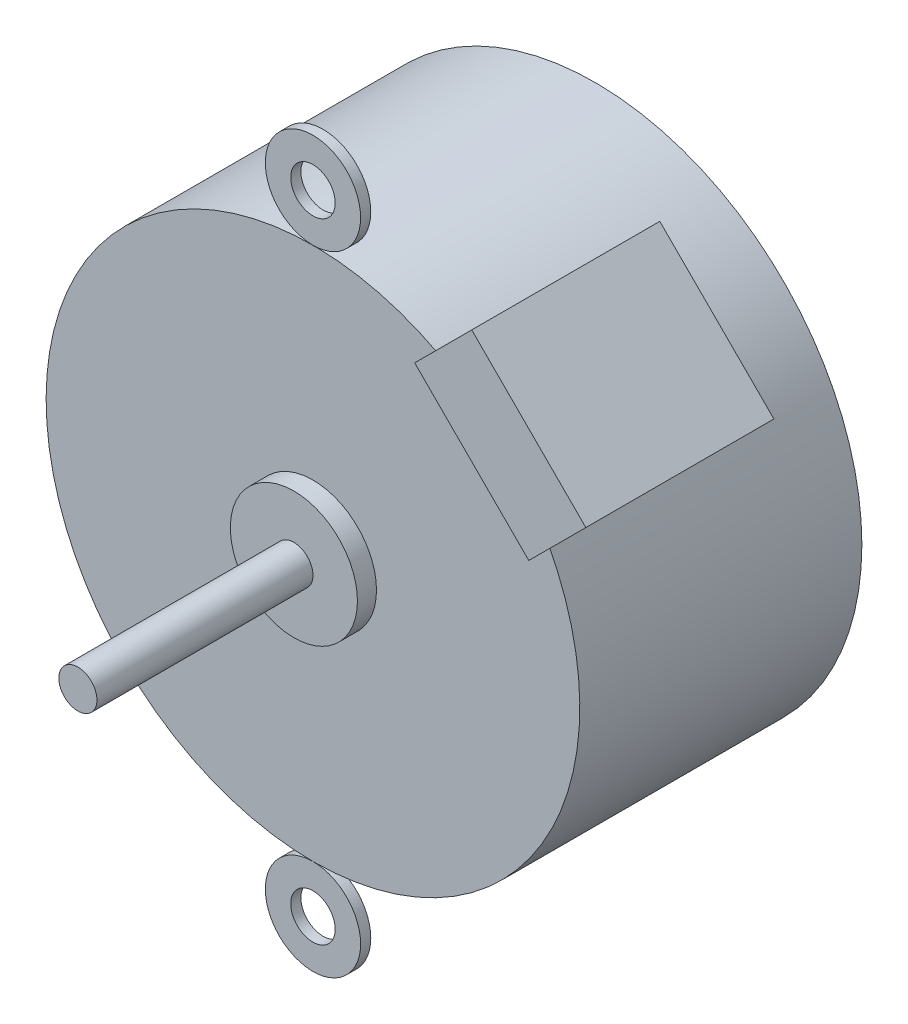
ISO-10303-21;
HEADER;
FILE_DESCRIPTION(('STEP AP214'),'2;1');
FILE_NAME('part.step','',(''),(''),'','','');
FILE_SCHEMA(('AUTOMOTIVE_DESIGN { 1 0 10303 214 1 1 1 1 }'));
ENDSEC;
DATA;
#1=APPLICATION_CONTEXT('core data for automotive mechanical design processes');
#2=APPLICATION_PROTOCOL_DEFINITION('international standard','automotive_design',2000,#1);
#3=PRODUCT_CONTEXT('',#1,'mechanical');
#4=PRODUCT('Part','Part','',(#3));
#5=PRODUCT_RELATED_PRODUCT_CATEGORY('part','',(#4));
#6=PRODUCT_DEFINITION_FORMATION('','',#4);
#7=PRODUCT_DEFINITION_CONTEXT('part definition',#1,'design');
#8=PRODUCT_DEFINITION('design','',#6,#7);
#9=PRODUCT_DEFINITION_SHAPE('','',#8);
#10=(LENGTH_UNIT() NAMED_UNIT(*) SI_UNIT(.MILLI.,.METRE.));
#11=(NAMED_UNIT(*) PLANE_ANGLE_UNIT() SI_UNIT($,.RADIAN.));
#12=(NAMED_UNIT(*) SI_UNIT($,.STERADIAN.) SOLID_ANGLE_UNIT());
#13=UNCERTAINTY_MEASURE_WITH_UNIT(LENGTH_MEASURE(1.E-05),#10,'distance_accuracy_value','');
#14=(GEOMETRIC_REPRESENTATION_CONTEXT(3) GLOBAL_UNCERTAINTY_ASSIGNED_CONTEXT((#13)) GLOBAL_UNIT_ASSIGNED_CONTEXT((#10,
#11,#12)) REPRESENTATION_CONTEXT('',''));
#15=CARTESIAN_POINT('',(0.,0.,0.));
#16=DIRECTION('',(0.,0.,1.));
#17=DIRECTION('',(1.,0.,0.));
#18=AXIS2_PLACEMENT_3D('',#15,#16,#17);
#19=CARTESIAN_POINT('',(0.,-24.75,0.8));
#20=DIRECTION('',(0.,0.,-1.));
#21=DIRECTION('',(-1.,0.,0.));
#22=AXIS2_PLACEMENT_3D('',#19,#20,#21);
#23=CYLINDRICAL_SURFACE('',#22,3.75);
#24=CARTESIAN_POINT('',(0.,-24.75,0.8));
#25=DIRECTION('',(0.,0.,1.));
#26=DIRECTION('',(1.,0.,0.));
#27=AXIS2_PLACEMENT_3D('',#24,#25,#26);
#28=CIRCLE('',#27,3.75);
#29=CARTESIAN_POINT('',(3.75,-24.75,0.8));
#30=VERTEX_POINT('',#29);
#31=EDGE_CURVE('E11',#30,#30,#28,.T.);
#32=ORIENTED_EDGE('',*,*,#31,.F.);
#33=EDGE_LOOP('',(#32));
#34=FACE_BOUND('',#33,.T.);
#35=CARTESIAN_POINT('',(0.,-24.75,0.));
#36=DIRECTION('',(0.,0.,1.));
#37=DIRECTION('',(1.,0.,0.));
#38=AXIS2_PLACEMENT_3D('',#35,#36,#37);
#39=CIRCLE('',#38,3.75);
#40=CARTESIAN_POINT('',(3.75,-24.75,0.));
#41=VERTEX_POINT('',#40);
#42=EDGE_CURVE('E54',#41,#41,#39,.T.);
#43=ORIENTED_EDGE('',*,*,#42,.T.);
#44=EDGE_LOOP('',(#43));
#45=FACE_BOUND('',#44,.T.);
#46=ADVANCED_FACE('F55',(#34,#45),#23,.T.);
#47=CARTESIAN_POINT('',(0.,-24.75,0.8));
#48=DIRECTION('',(0.,0.,1.));
#49=DIRECTION('',(1.,0.,0.));
#50=AXIS2_PLACEMENT_3D('',#47,#48,#49);
#51=PLANE('',#50);
#52=CARTESIAN_POINT('',(0.,-24.75,0.8));
#53=DIRECTION('',(0.,0.,1.));
#54=DIRECTION('',(1.,0.,0.));
#55=AXIS2_PLACEMENT_3D('',#52,#53,#54);
#56=CIRCLE('',#55,1.75);
#57=CARTESIAN_POINT('',(1.75,-24.75,0.8));
#58=VERTEX_POINT('',#57);
#59=EDGE_CURVE('E65',#58,#58,#56,.F.);
#60=ORIENTED_EDGE('',*,*,#59,.T.);
#61=EDGE_LOOP('',(#60));
#62=FACE_BOUND('',#61,.T.);
#63=ORIENTED_EDGE('',*,*,#31,.T.);
#64=EDGE_LOOP('',(#63));
#65=FACE_BOUND('',#64,.T.);
#66=ADVANCED_FACE('F79',(#62,#65),#51,.T.);
#67=CARTESIAN_POINT('',(0.,-24.75,0.));
#68=DIRECTION('',(0.,0.,1.));
#69=DIRECTION('',(1.,0.,0.));
#70=AXIS2_PLACEMENT_3D('',#67,#68,#69);
#71=PLANE('',#70);
#72=CARTESIAN_POINT('',(0.,-24.75,0.));
#73=DIRECTION('',(0.,0.,1.));
#74=DIRECTION('',(1.,0.,0.));
#75=AXIS2_PLACEMENT_3D('',#72,#73,#74);
#76=CIRCLE('',#75,1.75);
#77=CARTESIAN_POINT('',(1.75,-24.75,0.));
#78=VERTEX_POINT('',#77);
#79=EDGE_CURVE('E66',#78,#78,#76,.T.);
#80=ORIENTED_EDGE('',*,*,#79,.T.);
#81=EDGE_LOOP('',(#80));
#82=FACE_BOUND('',#81,.T.);
#83=ORIENTED_EDGE('',*,*,#42,.F.);
#84=EDGE_LOOP('',(#83));
#85=FACE_BOUND('',#84,.T.);
#86=ADVANCED_FACE('F69',(#82,#85),#71,.F.);
#87=CARTESIAN_POINT('',(0.,-24.75,1.8));
#88=DIRECTION('',(0.,0.,-1.));
#89=DIRECTION('',(-1.,0.,0.));
#90=AXIS2_PLACEMENT_3D('',#87,#88,#89);
#91=CYLINDRICAL_SURFACE('',#90,1.75);
#92=ORIENTED_EDGE('',*,*,#59,.F.);
#93=EDGE_LOOP('',(#92));
#94=FACE_BOUND('',#93,.T.);
#95=ORIENTED_EDGE('',*,*,#79,.F.);
#96=EDGE_LOOP('',(#95));
#97=FACE_BOUND('',#96,.T.);
#98=ADVANCED_FACE('F71',(#94,#97),#91,.F.);
#99=CLOSED_SHELL('',(#46,#66,#86,#98));
#100=MANIFOLD_SOLID_BREP('B2',#99);
#101=CARTESIAN_POINT('',(0.,24.75,0.8));
#102=DIRECTION('',(0.,0.,-1.));
#103=DIRECTION('',(-1.,0.,0.));
#104=AXIS2_PLACEMENT_3D('',#101,#102,#103);
#105=CYLINDRICAL_SURFACE('',#104,3.75);
#106=CARTESIAN_POINT('',(0.,24.75,0.8));
#107=DIRECTION('',(0.,0.,1.));
#108=DIRECTION('',(1.,0.,0.));
#109=AXIS2_PLACEMENT_3D('',#106,#107,#108);
#110=CIRCLE('',#109,3.75);
#111=CARTESIAN_POINT('',(3.75,24.75,0.8));
#112=VERTEX_POINT('',#111);
#113=EDGE_CURVE('E51',#112,#112,#110,.T.);
#114=ORIENTED_EDGE('',*,*,#113,.F.);
#115=EDGE_LOOP('',(#114));
#116=FACE_BOUND('',#115,.T.);
#117=CARTESIAN_POINT('',(0.,24.75,0.));
#118=DIRECTION('',(0.,0.,1.));
#119=DIRECTION('',(1.,0.,0.));
#120=AXIS2_PLACEMENT_3D('',#117,#118,#119);
#121=CIRCLE('',#120,3.75);
#122=CARTESIAN_POINT('',(3.75,24.75,0.));
#123=VERTEX_POINT('',#122);
#124=EDGE_CURVE('E127',#123,#123,#121,.T.);
#125=ORIENTED_EDGE('',*,*,#124,.T.);
#126=EDGE_LOOP('',(#125));
#127=FACE_BOUND('',#126,.T.);
#128=ADVANCED_FACE('F122',(#116,#127),#105,.T.);
#129=CARTESIAN_POINT('',(0.,24.75,0.8));
#130=DIRECTION('',(0.,0.,1.));
#131=DIRECTION('',(1.,0.,0.));
#132=AXIS2_PLACEMENT_3D('',#129,#130,#131);
#133=PLANE('',#132);
#134=CARTESIAN_POINT('',(0.,24.75,0.8));
#135=DIRECTION('',(0.,0.,1.));
#136=DIRECTION('',(1.,0.,0.));
#137=AXIS2_PLACEMENT_3D('',#134,#135,#136);
#138=CIRCLE('',#137,1.75);
#139=CARTESIAN_POINT('',(1.75,24.75,0.8));
#140=VERTEX_POINT('',#139);
#141=EDGE_CURVE('E132',#140,#140,#138,.F.);
#142=ORIENTED_EDGE('',*,*,#141,.T.);
#143=EDGE_LOOP('',(#142));
#144=FACE_BOUND('',#143,.T.);
#145=ORIENTED_EDGE('',*,*,#113,.T.);
#146=EDGE_LOOP('',(#145));
#147=FACE_BOUND('',#146,.T.);
#148=ADVANCED_FACE('F151',(#144,#147),#133,.T.);
#149=CARTESIAN_POINT('',(0.,24.75,0.));
#150=DIRECTION('',(0.,0.,1.));
#151=DIRECTION('',(1.,0.,0.));
#152=AXIS2_PLACEMENT_3D('',#149,#150,#151);
#153=PLANE('',#152);
#154=CARTESIAN_POINT('',(0.,24.75,0.));
#155=DIRECTION('',(0.,0.,1.));
#156=DIRECTION('',(1.,0.,0.));
#157=AXIS2_PLACEMENT_3D('',#154,#155,#156);
#158=CIRCLE('',#157,1.75);
#159=CARTESIAN_POINT('',(1.75,24.75,0.));
#160=VERTEX_POINT('',#159);
#161=EDGE_CURVE('E140',#160,#160,#158,.T.);
#162=ORIENTED_EDGE('',*,*,#161,.T.);
#163=EDGE_LOOP('',(#162));
#164=FACE_BOUND('',#163,.T.);
#165=ORIENTED_EDGE('',*,*,#124,.F.);
#166=EDGE_LOOP('',(#165));
#167=FACE_BOUND('',#166,.T.);
#168=ADVANCED_FACE('F143',(#164,#167),#153,.F.);
#169=CARTESIAN_POINT('',(0.,24.75,1.8));
#170=DIRECTION('',(0.,0.,-1.));
#171=DIRECTION('',(-1.,0.,0.));
#172=AXIS2_PLACEMENT_3D('',#169,#170,#171);
#173=CYLINDRICAL_SURFACE('',#172,1.75);
#174=ORIENTED_EDGE('',*,*,#141,.F.);
#175=EDGE_LOOP('',(#174));
#176=FACE_BOUND('',#175,.T.);
#177=ORIENTED_EDGE('',*,*,#161,.F.);
#178=EDGE_LOOP('',(#177));
#179=FACE_BOUND('',#178,.T.);
#180=ADVANCED_FACE('F145',(#176,#179),#173,.F.);
#181=CLOSED_SHELL('',(#128,#148,#168,#180));
#182=MANIFOLD_SOLID_BREP('B6',#181);
#183=CARTESIAN_POINT('',(0.,0.,0.8));
#184=DIRECTION('',(0.,0.,-1.));
#185=DIRECTION('',(-1.,0.,0.));
#186=AXIS2_PLACEMENT_3D('',#183,#184,#185);
#187=CYLINDRICAL_SURFACE('',#186,21.);
#188=CARTESIAN_POINT('',(0.,0.,-21.4));
#189=DIRECTION('',(0.,0.,1.));
#190=DIRECTION('',(1.,0.,0.));
#191=AXIS2_PLACEMENT_3D('',#188,#189,#190);
#192=CIRCLE('',#191,21.);
#193=CARTESIAN_POINT('',(21.,0.,-21.4));
#194=VERTEX_POINT('',#193);
#195=EDGE_CURVE('E307',#194,#194,#192,.T.);
#196=ORIENTED_EDGE('',*,*,#195,.T.);
#197=EDGE_LOOP('',(#196));
#198=FACE_BOUND('',#197,.T.);
#199=DIRECTION('',(0.,0.,-1.));
#200=VECTOR('',#199,1.);
#201=CARTESIAN_POINT('',(17.7167136960055,11.2746643326429,0.8));
#202=LINE('',#201,#200);
#203=CARTESIAN_POINT('',(17.7167136960055,11.2746643326429,-12.));
#204=VERTEX_POINT('',#203);
#205=CARTESIAN_POINT('',(17.7167136960055,11.2746643326429,0.8));
#206=VERTEX_POINT('',#205);
#207=EDGE_CURVE('E312',#204,#206,#202,.F.);
#208=ORIENTED_EDGE('',*,*,#207,.T.);
#209=CARTESIAN_POINT('',(0.,0.,0.8));
#210=DIRECTION('',(0.,0.,1.));
#211=DIRECTION('',(1.,0.,0.));
#212=AXIS2_PLACEMENT_3D('',#209,#210,#211);
#213=CIRCLE('',#212,21.);
#214=CARTESIAN_POINT('',(11.2746643326427,17.7167136960056,0.8));
#215=VERTEX_POINT('',#214);
#216=EDGE_CURVE('E313',#215,#206,#213,.T.);
#217=ORIENTED_EDGE('',*,*,#216,.F.);
#218=DIRECTION('',(0.,0.,-1.));
#219=VECTOR('',#218,1.);
#220=CARTESIAN_POINT('',(11.2746643326427,17.7167136960057,0.8));
#221=LINE('',#220,#219);
#222=CARTESIAN_POINT('',(11.2746643326427,17.7167136960057,-12.));
#223=VERTEX_POINT('',#222);
#224=EDGE_CURVE('E199',#215,#223,#221,.T.);
#225=ORIENTED_EDGE('',*,*,#224,.T.);
#226=CARTESIAN_POINT('',(0.,0.,-12.));
#227=DIRECTION('',(0.,0.,-1.));
#228=DIRECTION('',(-1.,0.,0.));
#229=AXIS2_PLACEMENT_3D('',#226,#227,#228);
#230=CIRCLE('',#229,21.);
#231=EDGE_CURVE('E192',#223,#204,#230,.T.);
#232=ORIENTED_EDGE('',*,*,#231,.T.);
#233=EDGE_LOOP('',(#208,#217,#225,#232));
#234=FACE_BOUND('',#233,.T.);
#235=ADVANCED_FACE('F183',(#198,#234),#187,.T.);
#236=CARTESIAN_POINT('',(0.,0.,0.8));
#237=DIRECTION('',(0.,0.,1.));
#238=DIRECTION('',(1.,0.,0.));
#239=AXIS2_PLACEMENT_3D('',#236,#237,#238);
#240=PLANE('',#239);
#241=CARTESIAN_POINT('',(0.,0.,0.8));
#242=DIRECTION('',(0.,0.,1.));
#243=DIRECTION('',(1.,0.,0.));
#244=AXIS2_PLACEMENT_3D('',#241,#242,#243);
#245=CIRCLE('',#244,5.);
#246=CARTESIAN_POINT('',(5.,0.,0.8));
#247=VERTEX_POINT('',#246);
#248=EDGE_CURVE('E301',#247,#247,#245,.F.);
#249=ORIENTED_EDGE('',*,*,#248,.T.);
#250=EDGE_LOOP('',(#249));
#251=FACE_BOUND('',#250,.T.);
#252=ORIENTED_EDGE('',*,*,#216,.T.);
#253=DIRECTION('',(-0.707106781186551,0.707106781186544,0.));
#254=VECTOR('',#253,1.);
#255=CARTESIAN_POINT('',(14.4956890143241,14.4956890143243,0.8));
#256=LINE('',#255,#254);
#257=EDGE_CURVE('E121',#206,#215,#256,.T.);
#258=ORIENTED_EDGE('',*,*,#257,.T.);
#259=EDGE_LOOP('',(#252,#258));
#260=FACE_BOUND('',#259,.T.);
#261=ADVANCED_FACE('F349',(#251,#260),#240,.T.);
#262=CARTESIAN_POINT('',(0.,0.,-21.4));
#263=DIRECTION('',(0.,0.,1.));
#264=DIRECTION('',(1.,0.,0.));
#265=AXIS2_PLACEMENT_3D('',#262,#263,#264);
#266=PLANE('',#265);
#267=CARTESIAN_POINT('',(0.,0.,-21.4));
#268=DIRECTION('',(0.,0.,1.));
#269=DIRECTION('',(1.,0.,0.));
#270=AXIS2_PLACEMENT_3D('',#267,#268,#269);
#271=CIRCLE('',#270,4.);
#272=CARTESIAN_POINT('',(4.,0.,-21.4));
#273=VERTEX_POINT('',#272);
#274=EDGE_CURVE('E308',#273,#273,#271,.T.);
#275=ORIENTED_EDGE('',*,*,#274,.T.);
#276=EDGE_LOOP('',(#275));
#277=FACE_BOUND('',#276,.T.);
#278=ORIENTED_EDGE('',*,*,#195,.F.);
#279=EDGE_LOOP('',(#278));
#280=FACE_BOUND('',#279,.T.);
#281=ADVANCED_FACE('F354',(#277,#280),#266,.F.);
#282=CARTESIAN_POINT('',(0.,0.,-22.4));
#283=DIRECTION('',(0.,0.,1.));
#284=DIRECTION('',(1.,0.,0.));
#285=AXIS2_PLACEMENT_3D('',#282,#283,#284);
#286=CYLINDRICAL_SURFACE('',#285,4.);
#287=CARTESIAN_POINT('',(0.,0.,-22.4));
#288=DIRECTION('',(0.,0.,1.));
#289=DIRECTION('',(1.,0.,0.));
#290=AXIS2_PLACEMENT_3D('',#287,#288,#289);
#291=CIRCLE('',#290,4.);
#292=CARTESIAN_POINT('',(4.,0.,-22.4));
#293=VERTEX_POINT('',#292);
#294=EDGE_CURVE('E305',#293,#293,#291,.T.);
#295=ORIENTED_EDGE('',*,*,#294,.T.);
#296=EDGE_LOOP('',(#295));
#297=FACE_BOUND('',#296,.T.);
#298=ORIENTED_EDGE('',*,*,#274,.F.);
#299=EDGE_LOOP('',(#298));
#300=FACE_BOUND('',#299,.T.);
#301=ADVANCED_FACE('F359',(#297,#300),#286,.T.);
#302=CARTESIAN_POINT('',(0.,0.,-22.4));
#303=DIRECTION('',(0.,0.,1.));
#304=DIRECTION('',(1.,0.,0.));
#305=AXIS2_PLACEMENT_3D('',#302,#303,#304);
#306=PLANE('',#305);
#307=ORIENTED_EDGE('',*,*,#294,.F.);
#308=EDGE_LOOP('',(#307));
#309=FACE_BOUND('',#308,.T.);
#310=ADVANCED_FACE('F368',(#309),#306,.F.);
#311=CARTESIAN_POINT('',(0.,0.,2.3));
#312=DIRECTION('',(0.,0.,-1.));
#313=DIRECTION('',(-1.,0.,0.));
#314=AXIS2_PLACEMENT_3D('',#311,#312,#313);
#315=CYLINDRICAL_SURFACE('',#314,5.);
#316=ORIENTED_EDGE('',*,*,#248,.F.);
#317=EDGE_LOOP('',(#316));
#318=FACE_BOUND('',#317,.T.);
#319=CARTESIAN_POINT('',(0.,0.,2.3));
#320=DIRECTION('',(0.,0.,1.));
#321=DIRECTION('',(1.,0.,0.));
#322=AXIS2_PLACEMENT_3D('',#319,#320,#321);
#323=CIRCLE('',#322,5.);
#324=CARTESIAN_POINT('',(5.,0.,2.3));
#325=VERTEX_POINT('',#324);
#326=EDGE_CURVE('E300',#325,#325,#323,.T.);
#327=ORIENTED_EDGE('',*,*,#326,.F.);
#328=EDGE_LOOP('',(#327));
#329=FACE_BOUND('',#328,.T.);
#330=ADVANCED_FACE('F375',(#318,#329),#315,.T.);
#331=CARTESIAN_POINT('',(0.,0.,2.3));
#332=DIRECTION('',(0.,0.,1.));
#333=DIRECTION('',(1.,0.,0.));
#334=AXIS2_PLACEMENT_3D('',#331,#332,#333);
#335=PLANE('',#334);
#336=CARTESIAN_POINT('',(0.,0.,2.3));
#337=DIRECTION('',(0.,0.,1.));
#338=DIRECTION('',(1.,0.,0.));
#339=AXIS2_PLACEMENT_3D('',#336,#337,#338);
#340=CIRCLE('',#339,1.5);
#341=CARTESIAN_POINT('',(1.5,0.,2.3));
#342=VERTEX_POINT('',#341);
#343=EDGE_CURVE('E296',#342,#342,#340,.F.);
#344=ORIENTED_EDGE('',*,*,#343,.T.);
#345=EDGE_LOOP('',(#344));
#346=FACE_BOUND('',#345,.T.);
#347=ORIENTED_EDGE('',*,*,#326,.T.);
#348=EDGE_LOOP('',(#347));
#349=FACE_BOUND('',#348,.T.);
#350=ADVANCED_FACE('F376',(#346,#349),#335,.T.);
#351=CARTESIAN_POINT('',(0.,0.,19.3));
#352=DIRECTION('',(0.,0.,-1.));
#353=DIRECTION('',(-1.,0.,0.));
#354=AXIS2_PLACEMENT_3D('',#351,#352,#353);
#355=CYLINDRICAL_SURFACE('',#354,1.5);
#356=ORIENTED_EDGE('',*,*,#343,.F.);
#357=EDGE_LOOP('',(#356));
#358=FACE_BOUND('',#357,.T.);
#359=CARTESIAN_POINT('',(0.,0.,19.3));
#360=DIRECTION('',(0.,0.,1.));
#361=DIRECTION('',(1.,0.,0.));
#362=AXIS2_PLACEMENT_3D('',#359,#360,#361);
#363=CIRCLE('',#362,1.5);
#364=CARTESIAN_POINT('',(1.5,0.,19.3));
#365=VERTEX_POINT('',#364);
#366=EDGE_CURVE('E290',#365,#365,#363,.T.);
#367=ORIENTED_EDGE('',*,*,#366,.F.);
#368=EDGE_LOOP('',(#367));
#369=FACE_BOUND('',#368,.T.);
#370=ADVANCED_FACE('F379',(#358,#369),#355,.T.);
#371=CARTESIAN_POINT('',(0.,0.,19.3));
#372=DIRECTION('',(0.,0.,1.));
#373=DIRECTION('',(1.,0.,0.));
#374=AXIS2_PLACEMENT_3D('',#371,#372,#373);
#375=PLANE('',#374);
#376=ORIENTED_EDGE('',*,*,#366,.T.);
#377=EDGE_LOOP('',(#376));
#378=FACE_BOUND('',#377,.T.);
#379=ADVANCED_FACE('F383',(#378),#375,.T.);
#380=CARTESIAN_POINT('',(18.9858170748588,10.0055609537896,-12.));
#381=DIRECTION('',(-0.707106781186544,-0.707106781186551,0.));
#382=DIRECTION('',(0.707106781186551,-0.707106781186544,0.));
#383=AXIS2_PLACEMENT_3D('',#380,#381,#382);
#384=PLANE('',#383);
#385=ORIENTED_EDGE('',*,*,#224,.F.);
#386=ORIENTED_EDGE('',*,*,#257,.F.);
#387=ORIENTED_EDGE('',*,*,#207,.F.);
#388=DIRECTION('',(0.707106781186551,-0.707106781186544,0.));
#389=VECTOR('',#388,1.);
#390=CARTESIAN_POINT('',(18.9858170748588,10.0055609537896,-12.));
#391=LINE('',#390,#389);
#392=CARTESIAN_POINT('',(18.9858170748588,10.0055609537896,-12.));
#393=VERTEX_POINT('',#392);
#394=EDGE_CURVE('E281',#204,#393,#391,.T.);
#395=ORIENTED_EDGE('',*,*,#394,.T.);
#396=DIRECTION('',(0.,0.,1.));
#397=VECTOR('',#396,1.);
#398=CARTESIAN_POINT('',(18.9858170748588,10.0055609537896,-12.));
#399=LINE('',#398,#397);
#400=CARTESIAN_POINT('',(18.9858170748588,10.0055609537896,2.8));
#401=VERTEX_POINT('',#400);
#402=EDGE_CURVE('E283',#393,#401,#399,.T.);
#403=ORIENTED_EDGE('',*,*,#402,.T.);
#404=DIRECTION('',(0.707106781186551,-0.707106781186544,0.));
#405=VECTOR('',#404,1.);
#406=CARTESIAN_POINT('',(18.9858170748588,10.0055609537896,2.8));
#407=LINE('',#406,#405);
#408=CARTESIAN_POINT('',(10.0055609537896,18.9858170748588,2.8));
#409=VERTEX_POINT('',#408);
#410=EDGE_CURVE('E262',#409,#401,#407,.T.);
#411=ORIENTED_EDGE('',*,*,#410,.F.);
#412=DIRECTION('',(0.,0.,1.));
#413=VECTOR('',#412,1.);
#414=CARTESIAN_POINT('',(10.0055609537896,18.9858170748588,-12.));
#415=LINE('',#414,#413);
#416=CARTESIAN_POINT('',(10.0055609537896,18.9858170748588,-12.));
#417=VERTEX_POINT('',#416);
#418=EDGE_CURVE('E287',#417,#409,#415,.T.);
#419=ORIENTED_EDGE('',*,*,#418,.F.);
#420=EDGE_CURVE('E249',#417,#223,#391,.T.);
#421=ORIENTED_EDGE('',*,*,#420,.T.);
#422=EDGE_LOOP('',(#385,#386,#387,#395,#403,#411,#419,#421));
#423=FACE_BOUND('',#422,.T.);
#424=ADVANCED_FACE('F334',(#423),#384,.T.);
#425=CARTESIAN_POINT('',(23.4759451353934,14.4956890143243,-12.));
#426=DIRECTION('',(0.707106781186548,-0.707106781186547,0.));
#427=DIRECTION('',(0.707106781186547,0.707106781186548,0.));
#428=AXIS2_PLACEMENT_3D('',#425,#426,#427);
#429=PLANE('',#428);
#430=DIRECTION('',(0.,0.,1.));
#431=VECTOR('',#430,1.);
#432=CARTESIAN_POINT('',(23.4759451353934,14.4956890143243,-12.));
#433=LINE('',#432,#431);
#434=CARTESIAN_POINT('',(23.4759451353934,14.4956890143243,-12.));
#435=VERTEX_POINT('',#434);
#436=CARTESIAN_POINT('',(23.4759451353934,14.4956890143242,2.8));
#437=VERTEX_POINT('',#436);
#438=EDGE_CURVE('E240',#435,#437,#433,.T.);
#439=ORIENTED_EDGE('',*,*,#438,.T.);
#440=DIRECTION('',(0.707106781186547,0.707106781186548,0.));
#441=VECTOR('',#440,1.);
#442=CARTESIAN_POINT('',(23.4759451353934,14.4956890143242,2.8));
#443=LINE('',#442,#441);
#444=EDGE_CURVE('E245',#401,#437,#443,.T.);
#445=ORIENTED_EDGE('',*,*,#444,.F.);
#446=ORIENTED_EDGE('',*,*,#402,.F.);
#447=DIRECTION('',(0.707106781186547,0.707106781186548,0.));
#448=VECTOR('',#447,1.);
#449=CARTESIAN_POINT('',(23.4759451353934,14.4956890143243,-12.));
#450=LINE('',#449,#448);
#451=EDGE_CURVE('E243',#393,#435,#450,.T.);
#452=ORIENTED_EDGE('',*,*,#451,.T.);
#453=EDGE_LOOP('',(#439,#445,#446,#452));
#454=FACE_BOUND('',#453,.T.);
#455=ADVANCED_FACE('F239',(#454),#429,.T.);
#456=CARTESIAN_POINT('',(10.0055609537896,18.9858170748588,-12.));
#457=DIRECTION('',(-0.707106781186551,0.707106781186544,0.));
#458=DIRECTION('',(-0.707106781186544,-0.707106781186551,0.));
#459=AXIS2_PLACEMENT_3D('',#456,#457,#458);
#460=PLANE('',#459);
#461=ORIENTED_EDGE('',*,*,#418,.T.);
#462=DIRECTION('',(-0.707106781186544,-0.707106781186551,0.));
#463=VECTOR('',#462,1.);
#464=CARTESIAN_POINT('',(10.0055609537896,18.9858170748588,2.8));
#465=LINE('',#464,#463);
#466=CARTESIAN_POINT('',(14.4956890143242,23.4759451353934,2.8));
#467=VERTEX_POINT('',#466);
#468=EDGE_CURVE('E259',#467,#409,#465,.T.);
#469=ORIENTED_EDGE('',*,*,#468,.F.);
#470=DIRECTION('',(0.,0.,1.));
#471=VECTOR('',#470,1.);
#472=CARTESIAN_POINT('',(14.4956890143242,23.4759451353934,-12.));
#473=LINE('',#472,#471);
#474=CARTESIAN_POINT('',(14.4956890143242,23.4759451353934,-12.));
#475=VERTEX_POINT('',#474);
#476=EDGE_CURVE('E248',#475,#467,#473,.T.);
#477=ORIENTED_EDGE('',*,*,#476,.F.);
#478=DIRECTION('',(-0.707106781186544,-0.707106781186551,0.));
#479=VECTOR('',#478,1.);
#480=CARTESIAN_POINT('',(10.0055609537896,18.9858170748588,-12.));
#481=LINE('',#480,#479);
#482=EDGE_CURVE('E280',#475,#417,#481,.T.);
#483=ORIENTED_EDGE('',*,*,#482,.T.);
#484=EDGE_LOOP('',(#461,#469,#477,#483));
#485=FACE_BOUND('',#484,.T.);
#486=ADVANCED_FACE('F337',(#485),#460,.T.);
#487=CARTESIAN_POINT('',(14.4956890143242,23.4759451353934,-12.));
#488=DIRECTION('',(0.707106781186544,0.707106781186551,0.));
#489=DIRECTION('',(-0.707106781186551,0.707106781186544,0.));
#490=AXIS2_PLACEMENT_3D('',#487,#488,#489);
#491=PLANE('',#490);
#492=ORIENTED_EDGE('',*,*,#476,.T.);
#493=DIRECTION('',(-0.707106781186548,0.707106781186547,0.));
#494=VECTOR('',#493,1.);
#495=CARTESIAN_POINT('',(14.4956890143242,23.4759451353934,2.8));
#496=LINE('',#495,#494);
#497=EDGE_CURVE('E251',#437,#467,#496,.T.);
#498=ORIENTED_EDGE('',*,*,#497,.F.);
#499=ORIENTED_EDGE('',*,*,#438,.F.);
#500=DIRECTION('',(-0.707106781186551,0.707106781186544,0.));
#501=VECTOR('',#500,1.);
#502=CARTESIAN_POINT('',(14.4956890143242,23.4759451353934,-12.));
#503=LINE('',#502,#501);
#504=EDGE_CURVE('E273',#435,#475,#503,.T.);
#505=ORIENTED_EDGE('',*,*,#504,.T.);
#506=EDGE_LOOP('',(#492,#498,#499,#505));
#507=FACE_BOUND('',#506,.T.);
#508=ADVANCED_FACE('F255',(#507),#491,.T.);
#509=CARTESIAN_POINT('',(0.,0.,-12.));
#510=DIRECTION('',(0.,0.,-1.));
#511=DIRECTION('',(-1.,0.,0.));
#512=AXIS2_PLACEMENT_3D('',#509,#510,#511);
#513=PLANE('',#512);
#514=ORIENTED_EDGE('',*,*,#231,.F.);
#515=ORIENTED_EDGE('',*,*,#420,.F.);
#516=ORIENTED_EDGE('',*,*,#482,.F.);
#517=ORIENTED_EDGE('',*,*,#504,.F.);
#518=ORIENTED_EDGE('',*,*,#451,.F.);
#519=ORIENTED_EDGE('',*,*,#394,.F.);
#520=EDGE_LOOP('',(#514,#515,#516,#517,#518,#519));
#521=FACE_BOUND('',#520,.T.);
#522=ADVANCED_FACE('F331',(#521),#513,.T.);
#523=CARTESIAN_POINT('',(0.,0.,2.8));
#524=DIRECTION('',(0.,0.,-1.));
#525=DIRECTION('',(-1.,0.,0.));
#526=AXIS2_PLACEMENT_3D('',#523,#524,#525);
#527=PLANE('',#526);
#528=ORIENTED_EDGE('',*,*,#444,.T.);
#529=ORIENTED_EDGE('',*,*,#497,.T.);
#530=ORIENTED_EDGE('',*,*,#468,.T.);
#531=ORIENTED_EDGE('',*,*,#410,.T.);
#532=EDGE_LOOP('',(#528,#529,#530,#531));
#533=FACE_BOUND('',#532,.T.);
#534=ADVANCED_FACE('F265',(#533),#527,.F.);
#535=CLOSED_SHELL('',(#235,#261,#281,#301,#310,#330,#350,#370,#379,#424,#455,#486,#508,#522,#534));
#536=MANIFOLD_SOLID_BREP('B46',#535);
#537=ADVANCED_BREP_SHAPE_REPRESENTATION('',(#18,#100,#182,#536),#14);
#538=SHAPE_DEFINITION_REPRESENTATION(#9,#537);
ENDSEC;
END-ISO-10303-21;
